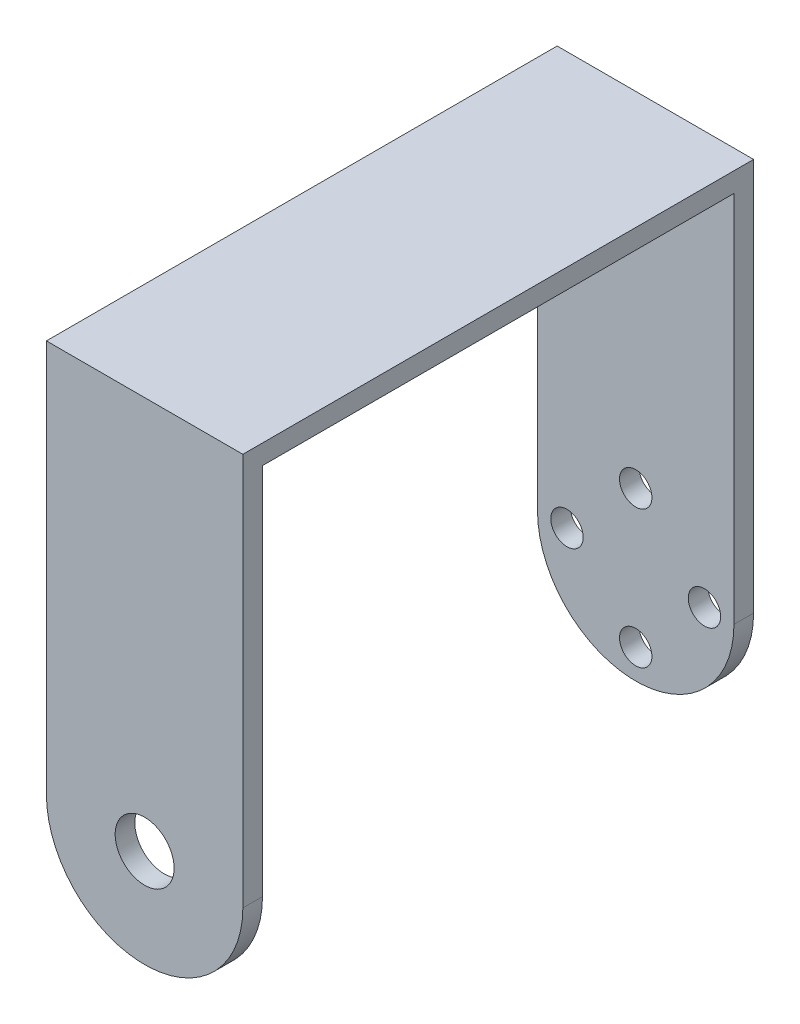
ISO-10303-21;
HEADER;
FILE_DESCRIPTION(('STEP AP214'),'2;1');
FILE_NAME('part.step','',(''),(''),'','','');
FILE_SCHEMA(('AUTOMOTIVE_DESIGN { 1 0 10303 214 1 1 1 1 }'));
ENDSEC;
DATA;
#1=APPLICATION_CONTEXT('core data for automotive mechanical design processes');
#2=APPLICATION_PROTOCOL_DEFINITION('international standard','automotive_design',2000,#1);
#3=PRODUCT_CONTEXT('',#1,'mechanical');
#4=PRODUCT('Part','Part','',(#3));
#5=PRODUCT_RELATED_PRODUCT_CATEGORY('part','',(#4));
#6=PRODUCT_DEFINITION_FORMATION('','',#4);
#7=PRODUCT_DEFINITION_CONTEXT('part definition',#1,'design');
#8=PRODUCT_DEFINITION('design','',#6,#7);
#9=PRODUCT_DEFINITION_SHAPE('','',#8);
#10=(LENGTH_UNIT() NAMED_UNIT(*) SI_UNIT(.MILLI.,.METRE.));
#11=(NAMED_UNIT(*) PLANE_ANGLE_UNIT() SI_UNIT($,.RADIAN.));
#12=(NAMED_UNIT(*) SI_UNIT($,.STERADIAN.) SOLID_ANGLE_UNIT());
#13=UNCERTAINTY_MEASURE_WITH_UNIT(LENGTH_MEASURE(1.E-05),#10,'distance_accuracy_value','');
#14=(GEOMETRIC_REPRESENTATION_CONTEXT(3) GLOBAL_UNCERTAINTY_ASSIGNED_CONTEXT((#13)) GLOBAL_UNIT_ASSIGNED_CONTEXT((#10,
#11,#12)) REPRESENTATION_CONTEXT('',''));
#15=CARTESIAN_POINT('',(0.,0.,0.));
#16=DIRECTION('',(0.,0.,1.));
#17=DIRECTION('',(1.,0.,0.));
#18=AXIS2_PLACEMENT_3D('',#15,#16,#17);
#19=CARTESIAN_POINT('',(0.,38.,52.));
#20=DIRECTION('',(0.,1.,0.));
#21=DIRECTION('',(0.,0.,1.));
#22=AXIS2_PLACEMENT_3D('',#19,#20,#21);
#23=PLANE('',#22);
#24=DIRECTION('',(1.,0.,0.));
#25=VECTOR('',#24,1.);
#26=CARTESIAN_POINT('',(0.,38.,50.));
#27=LINE('',#26,#25);
#28=CARTESIAN_POINT('',(0.,38.,50.));
#29=VERTEX_POINT('',#28);
#30=CARTESIAN_POINT('',(20.,38.,50.));
#31=VERTEX_POINT('',#30);
#32=EDGE_CURVE('E11',#29,#31,#27,.T.);
#33=ORIENTED_EDGE('',*,*,#32,.F.);
#34=DIRECTION('',(0.,0.,-1.));
#35=VECTOR('',#34,1.);
#36=CARTESIAN_POINT('',(0.,38.,52.));
#37=LINE('',#36,#35);
#38=CARTESIAN_POINT('',(0.,38.,2.));
#39=VERTEX_POINT('',#38);
#40=EDGE_CURVE('E55',#29,#39,#37,.T.);
#41=ORIENTED_EDGE('',*,*,#40,.T.);
#42=DIRECTION('',(1.,0.,0.));
#43=VECTOR('',#42,1.);
#44=CARTESIAN_POINT('',(0.,38.,2.));
#45=LINE('',#44,#43);
#46=CARTESIAN_POINT('',(20.,38.,2.));
#47=VERTEX_POINT('',#46);
#48=EDGE_CURVE('E143',#39,#47,#45,.T.);
#49=ORIENTED_EDGE('',*,*,#48,.T.);
#50=DIRECTION('',(0.,0.,-1.));
#51=VECTOR('',#50,1.);
#52=CARTESIAN_POINT('',(20.,38.,52.));
#53=LINE('',#52,#51);
#54=EDGE_CURVE('E113',#31,#47,#53,.T.);
#55=ORIENTED_EDGE('',*,*,#54,.F.);
#56=EDGE_LOOP('',(#33,#41,#49,#55));
#57=FACE_BOUND('',#56,.T.);
#58=ADVANCED_FACE('F39',(#57),#23,.F.);
#59=CARTESIAN_POINT('',(10.,0.,2.));
#60=DIRECTION('',(0.,0.,-1.));
#61=DIRECTION('',(-1.,0.,0.));
#62=AXIS2_PLACEMENT_3D('',#59,#60,#61);
#63=PLANE('',#62);
#64=CARTESIAN_POINT('',(10.,-7.,2.));
#65=DIRECTION('',(0.,0.,-1.));
#66=DIRECTION('',(-1.,0.,0.));
#67=AXIS2_PLACEMENT_3D('',#64,#65,#66);
#68=CIRCLE('',#67,1.65);
#69=CARTESIAN_POINT('',(8.35,-7.,2.));
#70=VERTEX_POINT('',#69);
#71=EDGE_CURVE('E188',#70,#70,#68,.F.);
#72=ORIENTED_EDGE('',*,*,#71,.F.);
#73=EDGE_LOOP('',(#72));
#74=FACE_BOUND('',#73,.T.);
#75=CARTESIAN_POINT('',(17.,0.,2.));
#76=DIRECTION('',(0.,0.,-1.));
#77=DIRECTION('',(-1.,0.,0.));
#78=AXIS2_PLACEMENT_3D('',#75,#76,#77);
#79=CIRCLE('',#78,1.65);
#80=CARTESIAN_POINT('',(15.35,0.,2.));
#81=VERTEX_POINT('',#80);
#82=EDGE_CURVE('E209',#81,#81,#79,.F.);
#83=ORIENTED_EDGE('',*,*,#82,.F.);
#84=EDGE_LOOP('',(#83));
#85=FACE_BOUND('',#84,.T.);
#86=CARTESIAN_POINT('',(9.99999999999995,6.99999999999993,2.));
#87=DIRECTION('',(0.,0.,-1.));
#88=DIRECTION('',(-1.,0.,0.));
#89=AXIS2_PLACEMENT_3D('',#86,#87,#88);
#90=CIRCLE('',#89,1.65);
#91=CARTESIAN_POINT('',(8.34999999999995,6.99999999999993,2.));
#92=VERTEX_POINT('',#91);
#93=EDGE_CURVE('E201',#92,#92,#90,.F.);
#94=ORIENTED_EDGE('',*,*,#93,.F.);
#95=EDGE_LOOP('',(#94));
#96=FACE_BOUND('',#95,.T.);
#97=CARTESIAN_POINT('',(3.00000000000004,-1.05818132034585E-13,2.));
#98=DIRECTION('',(0.,0.,-1.));
#99=DIRECTION('',(-1.,0.,0.));
#100=AXIS2_PLACEMENT_3D('',#97,#98,#99);
#101=CIRCLE('',#100,1.65);
#102=CARTESIAN_POINT('',(1.35000000000004,-1.05818132034585E-13,2.));
#103=VERTEX_POINT('',#102);
#104=EDGE_CURVE('E193',#103,#103,#101,.F.);
#105=ORIENTED_EDGE('',*,*,#104,.F.);
#106=EDGE_LOOP('',(#105));
#107=FACE_BOUND('',#106,.T.);
#108=ORIENTED_EDGE('',*,*,#48,.F.);
#109=DIRECTION('',(0.,-1.,0.));
#110=VECTOR('',#109,1.);
#111=CARTESIAN_POINT('',(0.,0.,2.));
#112=LINE('',#111,#110);
#113=CARTESIAN_POINT('',(0.,0.,2.));
#114=VERTEX_POINT('',#113);
#115=EDGE_CURVE('E63',#39,#114,#112,.T.);
#116=ORIENTED_EDGE('',*,*,#115,.T.);
#117=CARTESIAN_POINT('',(10.,0.,2.));
#118=DIRECTION('',(0.,0.,1.));
#119=DIRECTION('',(-1.,0.,0.));
#120=AXIS2_PLACEMENT_3D('',#117,#118,#119);
#121=CIRCLE('',#120,10.);
#122=CARTESIAN_POINT('',(20.,0.,2.));
#123=VERTEX_POINT('',#122);
#124=EDGE_CURVE('E95',#114,#123,#121,.T.);
#125=ORIENTED_EDGE('',*,*,#124,.T.);
#126=DIRECTION('',(0.,1.,0.));
#127=VECTOR('',#126,1.);
#128=CARTESIAN_POINT('',(20.,0.,2.));
#129=LINE('',#128,#127);
#130=EDGE_CURVE('E131',#123,#47,#129,.T.);
#131=ORIENTED_EDGE('',*,*,#130,.T.);
#132=EDGE_LOOP('',(#108,#116,#125,#131));
#133=FACE_BOUND('',#132,.T.);
#134=ADVANCED_FACE('F136',(#74,#85,#96,#107,#133),#63,.F.);
#135=CARTESIAN_POINT('',(10.,0.,2.));
#136=DIRECTION('',(0.,0.,-1.));
#137=DIRECTION('',(-1.,0.,0.));
#138=AXIS2_PLACEMENT_3D('',#135,#136,#137);
#139=CYLINDRICAL_SURFACE('',#138,10.);
#140=CARTESIAN_POINT('',(10.,0.,0.));
#141=DIRECTION('',(0.,0.,1.));
#142=DIRECTION('',(-1.,0.,0.));
#143=AXIS2_PLACEMENT_3D('',#140,#141,#142);
#144=CIRCLE('',#143,10.);
#145=CARTESIAN_POINT('',(0.,0.,0.));
#146=VERTEX_POINT('',#145);
#147=CARTESIAN_POINT('',(20.,0.,0.));
#148=VERTEX_POINT('',#147);
#149=EDGE_CURVE('E101',#146,#148,#144,.T.);
#150=ORIENTED_EDGE('',*,*,#149,.T.);
#151=DIRECTION('',(0.,0.,-1.));
#152=VECTOR('',#151,1.);
#153=CARTESIAN_POINT('',(20.,0.,2.));
#154=LINE('',#153,#152);
#155=EDGE_CURVE('E48',#123,#148,#154,.T.);
#156=ORIENTED_EDGE('',*,*,#155,.F.);
#157=ORIENTED_EDGE('',*,*,#124,.F.);
#158=DIRECTION('',(0.,0.,-1.));
#159=VECTOR('',#158,1.);
#160=CARTESIAN_POINT('',(0.,0.,2.));
#161=LINE('',#160,#159);
#162=EDGE_CURVE('E85',#114,#146,#161,.T.);
#163=ORIENTED_EDGE('',*,*,#162,.T.);
#164=EDGE_LOOP('',(#150,#156,#157,#163));
#165=FACE_BOUND('',#164,.T.);
#166=ADVANCED_FACE('F41',(#165),#139,.T.);
#167=CARTESIAN_POINT('',(20.,0.,2.));
#168=DIRECTION('',(-1.,0.,0.));
#169=DIRECTION('',(0.,0.,1.));
#170=AXIS2_PLACEMENT_3D('',#167,#168,#169);
#171=PLANE('',#170);
#172=DIRECTION('',(0.,1.,0.));
#173=VECTOR('',#172,1.);
#174=CARTESIAN_POINT('',(20.,40.,52.));
#175=LINE('',#174,#173);
#176=CARTESIAN_POINT('',(20.,0.,52.));
#177=VERTEX_POINT('',#176);
#178=CARTESIAN_POINT('',(20.,40.,52.));
#179=VERTEX_POINT('',#178);
#180=EDGE_CURVE('E151',#177,#179,#175,.T.);
#181=ORIENTED_EDGE('',*,*,#180,.F.);
#182=DIRECTION('',(0.,0.,1.));
#183=VECTOR('',#182,1.);
#184=CARTESIAN_POINT('',(20.,0.,50.));
#185=LINE('',#184,#183);
#186=CARTESIAN_POINT('',(20.,0.,50.));
#187=VERTEX_POINT('',#186);
#188=EDGE_CURVE('E161',#187,#177,#185,.T.);
#189=ORIENTED_EDGE('',*,*,#188,.F.);
#190=DIRECTION('',(0.,1.,0.));
#191=VECTOR('',#190,1.);
#192=CARTESIAN_POINT('',(20.,0.,50.));
#193=LINE('',#192,#191);
#194=EDGE_CURVE('E165',#187,#31,#193,.T.);
#195=ORIENTED_EDGE('',*,*,#194,.T.);
#196=ORIENTED_EDGE('',*,*,#54,.T.);
#197=ORIENTED_EDGE('',*,*,#130,.F.);
#198=ORIENTED_EDGE('',*,*,#155,.T.);
#199=DIRECTION('',(0.,1.,0.));
#200=VECTOR('',#199,1.);
#201=CARTESIAN_POINT('',(20.,0.,0.));
#202=LINE('',#201,#200);
#203=CARTESIAN_POINT('',(20.,40.,0.));
#204=VERTEX_POINT('',#203);
#205=EDGE_CURVE('E106',#148,#204,#202,.T.);
#206=ORIENTED_EDGE('',*,*,#205,.T.);
#207=DIRECTION('',(0.,0.,-1.));
#208=VECTOR('',#207,1.);
#209=CARTESIAN_POINT('',(20.,40.,2.));
#210=LINE('',#209,#208);
#211=EDGE_CURVE('E122',#179,#204,#210,.T.);
#212=ORIENTED_EDGE('',*,*,#211,.F.);
#213=EDGE_LOOP('',(#181,#189,#195,#196,#197,#198,#206,#212));
#214=FACE_BOUND('',#213,.T.);
#215=ADVANCED_FACE('F127',(#214),#171,.F.);
#216=CARTESIAN_POINT('',(0.,40.,2.));
#217=DIRECTION('',(0.,-1.,0.));
#218=DIRECTION('',(0.,0.,-1.));
#219=AXIS2_PLACEMENT_3D('',#216,#217,#218);
#220=PLANE('',#219);
#221=ORIENTED_EDGE('',*,*,#211,.T.);
#222=DIRECTION('',(-1.,0.,0.));
#223=VECTOR('',#222,1.);
#224=CARTESIAN_POINT('',(0.,40.,0.));
#225=LINE('',#224,#223);
#226=CARTESIAN_POINT('',(0.,40.,0.));
#227=VERTEX_POINT('',#226);
#228=EDGE_CURVE('E96',#204,#227,#225,.T.);
#229=ORIENTED_EDGE('',*,*,#228,.T.);
#230=DIRECTION('',(0.,0.,-1.));
#231=VECTOR('',#230,1.);
#232=CARTESIAN_POINT('',(0.,40.,2.));
#233=LINE('',#232,#231);
#234=CARTESIAN_POINT('',(0.,40.,52.));
#235=VERTEX_POINT('',#234);
#236=EDGE_CURVE('E89',#235,#227,#233,.T.);
#237=ORIENTED_EDGE('',*,*,#236,.F.);
#238=DIRECTION('',(-1.,0.,0.));
#239=VECTOR('',#238,1.);
#240=CARTESIAN_POINT('',(0.,40.,52.));
#241=LINE('',#240,#239);
#242=EDGE_CURVE('E142',#179,#235,#241,.T.);
#243=ORIENTED_EDGE('',*,*,#242,.F.);
#244=EDGE_LOOP('',(#221,#229,#237,#243));
#245=FACE_BOUND('',#244,.T.);
#246=ADVANCED_FACE('F261',(#245),#220,.F.);
#247=CARTESIAN_POINT('',(0.,0.,2.));
#248=DIRECTION('',(1.,0.,0.));
#249=DIRECTION('',(0.,0.,-1.));
#250=AXIS2_PLACEMENT_3D('',#247,#248,#249);
#251=PLANE('',#250);
#252=ORIENTED_EDGE('',*,*,#236,.T.);
#253=DIRECTION('',(0.,-1.,0.));
#254=VECTOR('',#253,1.);
#255=CARTESIAN_POINT('',(0.,0.,0.));
#256=LINE('',#255,#254);
#257=EDGE_CURVE('E82',#227,#146,#256,.T.);
#258=ORIENTED_EDGE('',*,*,#257,.T.);
#259=ORIENTED_EDGE('',*,*,#162,.F.);
#260=ORIENTED_EDGE('',*,*,#115,.F.);
#261=ORIENTED_EDGE('',*,*,#40,.F.);
#262=DIRECTION('',(0.,-1.,0.));
#263=VECTOR('',#262,1.);
#264=CARTESIAN_POINT('',(0.,0.,50.));
#265=LINE('',#264,#263);
#266=CARTESIAN_POINT('',(0.,0.,50.));
#267=VERTEX_POINT('',#266);
#268=EDGE_CURVE('E174',#29,#267,#265,.T.);
#269=ORIENTED_EDGE('',*,*,#268,.T.);
#270=DIRECTION('',(0.,0.,1.));
#271=VECTOR('',#270,1.);
#272=CARTESIAN_POINT('',(0.,0.,50.));
#273=LINE('',#272,#271);
#274=CARTESIAN_POINT('',(0.,0.,52.));
#275=VERTEX_POINT('',#274);
#276=EDGE_CURVE('E147',#267,#275,#273,.T.);
#277=ORIENTED_EDGE('',*,*,#276,.T.);
#278=DIRECTION('',(0.,-1.,0.));
#279=VECTOR('',#278,1.);
#280=CARTESIAN_POINT('',(0.,40.,52.));
#281=LINE('',#280,#279);
#282=EDGE_CURVE('E146',#235,#275,#281,.T.);
#283=ORIENTED_EDGE('',*,*,#282,.F.);
#284=EDGE_LOOP('',(#252,#258,#259,#260,#261,#269,#277,#283));
#285=FACE_BOUND('',#284,.T.);
#286=ADVANCED_FACE('F84',(#285),#251,.F.);
#287=CARTESIAN_POINT('',(10.,0.,0.));
#288=DIRECTION('',(0.,0.,-1.));
#289=DIRECTION('',(-1.,0.,0.));
#290=AXIS2_PLACEMENT_3D('',#287,#288,#289);
#291=PLANE('',#290);
#292=CARTESIAN_POINT('',(10.,-7.,0.));
#293=DIRECTION('',(0.,0.,-1.));
#294=DIRECTION('',(-1.,0.,0.));
#295=AXIS2_PLACEMENT_3D('',#292,#293,#294);
#296=CIRCLE('',#295,1.65);
#297=CARTESIAN_POINT('',(8.35,-7.,0.));
#298=VERTEX_POINT('',#297);
#299=EDGE_CURVE('E213',#298,#298,#296,.T.);
#300=ORIENTED_EDGE('',*,*,#299,.F.);
#301=EDGE_LOOP('',(#300));
#302=FACE_BOUND('',#301,.T.);
#303=CARTESIAN_POINT('',(17.,0.,0.));
#304=DIRECTION('',(0.,0.,-1.));
#305=DIRECTION('',(-1.,0.,0.));
#306=AXIS2_PLACEMENT_3D('',#303,#304,#305);
#307=CIRCLE('',#306,1.65);
#308=CARTESIAN_POINT('',(15.35,0.,0.));
#309=VERTEX_POINT('',#308);
#310=EDGE_CURVE('E205',#309,#309,#307,.T.);
#311=ORIENTED_EDGE('',*,*,#310,.F.);
#312=EDGE_LOOP('',(#311));
#313=FACE_BOUND('',#312,.T.);
#314=CARTESIAN_POINT('',(9.99999999999995,6.99999999999993,0.));
#315=DIRECTION('',(0.,0.,-1.));
#316=DIRECTION('',(-1.,0.,0.));
#317=AXIS2_PLACEMENT_3D('',#314,#315,#316);
#318=CIRCLE('',#317,1.65);
#319=CARTESIAN_POINT('',(8.34999999999995,6.99999999999993,0.));
#320=VERTEX_POINT('',#319);
#321=EDGE_CURVE('E197',#320,#320,#318,.T.);
#322=ORIENTED_EDGE('',*,*,#321,.F.);
#323=EDGE_LOOP('',(#322));
#324=FACE_BOUND('',#323,.T.);
#325=CARTESIAN_POINT('',(3.00000000000004,-1.05818132034585E-13,0.));
#326=DIRECTION('',(0.,0.,-1.));
#327=DIRECTION('',(-1.,0.,0.));
#328=AXIS2_PLACEMENT_3D('',#325,#326,#327);
#329=CIRCLE('',#328,1.65);
#330=CARTESIAN_POINT('',(1.35000000000004,-1.05818132034585E-13,0.));
#331=VERTEX_POINT('',#330);
#332=EDGE_CURVE('E189',#331,#331,#329,.T.);
#333=ORIENTED_EDGE('',*,*,#332,.F.);
#334=EDGE_LOOP('',(#333));
#335=FACE_BOUND('',#334,.T.);
#336=ORIENTED_EDGE('',*,*,#149,.F.);
#337=ORIENTED_EDGE('',*,*,#257,.F.);
#338=ORIENTED_EDGE('',*,*,#228,.F.);
#339=ORIENTED_EDGE('',*,*,#205,.F.);
#340=EDGE_LOOP('',(#336,#337,#338,#339));
#341=FACE_BOUND('',#340,.T.);
#342=ADVANCED_FACE('F104',(#302,#313,#324,#335,#341),#291,.T.);
#343=CARTESIAN_POINT('',(0.,0.,52.));
#344=DIRECTION('',(0.,0.,1.));
#345=DIRECTION('',(1.,0.,0.));
#346=AXIS2_PLACEMENT_3D('',#343,#344,#345);
#347=PLANE('',#346);
#348=CARTESIAN_POINT('',(10.,0.,52.));
#349=DIRECTION('',(0.,0.,1.));
#350=DIRECTION('',(1.,0.,0.));
#351=AXIS2_PLACEMENT_3D('',#348,#349,#350);
#352=CIRCLE('',#351,3.);
#353=CARTESIAN_POINT('',(13.,0.,52.));
#354=VERTEX_POINT('',#353);
#355=EDGE_CURVE('E184',#354,#354,#352,.T.);
#356=ORIENTED_EDGE('',*,*,#355,.F.);
#357=EDGE_LOOP('',(#356));
#358=FACE_BOUND('',#357,.T.);
#359=ORIENTED_EDGE('',*,*,#282,.T.);
#360=CARTESIAN_POINT('',(10.,0.,52.));
#361=DIRECTION('',(0.,0.,1.));
#362=DIRECTION('',(-1.,0.,0.));
#363=AXIS2_PLACEMENT_3D('',#360,#361,#362);
#364=CIRCLE('',#363,10.);
#365=EDGE_CURVE('E166',#275,#177,#364,.T.);
#366=ORIENTED_EDGE('',*,*,#365,.T.);
#367=ORIENTED_EDGE('',*,*,#180,.T.);
#368=ORIENTED_EDGE('',*,*,#242,.T.);
#369=EDGE_LOOP('',(#359,#366,#367,#368));
#370=FACE_BOUND('',#369,.T.);
#371=ADVANCED_FACE('F253',(#358,#370),#347,.T.);
#372=CARTESIAN_POINT('',(10.,0.,50.));
#373=DIRECTION('',(0.,0.,1.));
#374=DIRECTION('',(-1.,0.,0.));
#375=AXIS2_PLACEMENT_3D('',#372,#373,#374);
#376=PLANE('',#375);
#377=CARTESIAN_POINT('',(10.,0.,50.));
#378=DIRECTION('',(0.,0.,1.));
#379=DIRECTION('',(1.,0.,0.));
#380=AXIS2_PLACEMENT_3D('',#377,#378,#379);
#381=CIRCLE('',#380,3.);
#382=CARTESIAN_POINT('',(13.,0.,50.));
#383=VERTEX_POINT('',#382);
#384=EDGE_CURVE('E171',#383,#383,#381,.F.);
#385=ORIENTED_EDGE('',*,*,#384,.F.);
#386=EDGE_LOOP('',(#385));
#387=FACE_BOUND('',#386,.T.);
#388=ORIENTED_EDGE('',*,*,#268,.F.);
#389=ORIENTED_EDGE('',*,*,#32,.T.);
#390=ORIENTED_EDGE('',*,*,#194,.F.);
#391=CARTESIAN_POINT('',(10.,0.,50.));
#392=DIRECTION('',(0.,0.,1.));
#393=DIRECTION('',(-1.,0.,0.));
#394=AXIS2_PLACEMENT_3D('',#391,#392,#393);
#395=CIRCLE('',#394,10.);
#396=EDGE_CURVE('E170',#267,#187,#395,.T.);
#397=ORIENTED_EDGE('',*,*,#396,.F.);
#398=EDGE_LOOP('',(#388,#389,#390,#397));
#399=FACE_BOUND('',#398,.T.);
#400=ADVANCED_FACE('F336',(#387,#399),#376,.F.);
#401=CARTESIAN_POINT('',(10.,0.,50.));
#402=DIRECTION('',(0.,0.,1.));
#403=DIRECTION('',(1.,0.,0.));
#404=AXIS2_PLACEMENT_3D('',#401,#402,#403);
#405=CYLINDRICAL_SURFACE('',#404,10.);
#406=ORIENTED_EDGE('',*,*,#365,.F.);
#407=ORIENTED_EDGE('',*,*,#276,.F.);
#408=ORIENTED_EDGE('',*,*,#396,.T.);
#409=ORIENTED_EDGE('',*,*,#188,.T.);
#410=EDGE_LOOP('',(#406,#407,#408,#409));
#411=FACE_BOUND('',#410,.T.);
#412=ADVANCED_FACE('F245',(#411),#405,.T.);
#413=CARTESIAN_POINT('',(10.,0.,-0.001000000000001));
#414=DIRECTION('',(0.,0.,1.));
#415=DIRECTION('',(1.,0.,0.));
#416=AXIS2_PLACEMENT_3D('',#413,#414,#415);
#417=CYLINDRICAL_SURFACE('',#416,3.);
#418=ORIENTED_EDGE('',*,*,#355,.T.);
#419=EDGE_LOOP('',(#418));
#420=FACE_BOUND('',#419,.T.);
#421=ORIENTED_EDGE('',*,*,#384,.T.);
#422=EDGE_LOOP('',(#421));
#423=FACE_BOUND('',#422,.T.);
#424=ADVANCED_FACE('F235',(#420,#423),#417,.F.);
#425=CARTESIAN_POINT('',(3.00000000000004,-1.05818132034585E-13,52.001));
#426=DIRECTION('',(0.,0.,-1.));
#427=DIRECTION('',(-1.,0.,0.));
#428=AXIS2_PLACEMENT_3D('',#425,#426,#427);
#429=CYLINDRICAL_SURFACE('',#428,1.65);
#430=ORIENTED_EDGE('',*,*,#332,.T.);
#431=EDGE_LOOP('',(#430));
#432=FACE_BOUND('',#431,.T.);
#433=ORIENTED_EDGE('',*,*,#104,.T.);
#434=EDGE_LOOP('',(#433));
#435=FACE_BOUND('',#434,.T.);
#436=ADVANCED_FACE('F232',(#432,#435),#429,.F.);
#437=CARTESIAN_POINT('',(9.99999999999995,6.99999999999993,52.001));
#438=DIRECTION('',(0.,0.,-1.));
#439=DIRECTION('',(-1.,0.,0.));
#440=AXIS2_PLACEMENT_3D('',#437,#438,#439);
#441=CYLINDRICAL_SURFACE('',#440,1.65);
#442=ORIENTED_EDGE('',*,*,#321,.T.);
#443=EDGE_LOOP('',(#442));
#444=FACE_BOUND('',#443,.T.);
#445=ORIENTED_EDGE('',*,*,#93,.T.);
#446=EDGE_LOOP('',(#445));
#447=FACE_BOUND('',#446,.T.);
#448=ADVANCED_FACE('F234',(#444,#447),#441,.F.);
#449=CARTESIAN_POINT('',(17.,0.,52.001));
#450=DIRECTION('',(0.,0.,-1.));
#451=DIRECTION('',(-1.,0.,0.));
#452=AXIS2_PLACEMENT_3D('',#449,#450,#451);
#453=CYLINDRICAL_SURFACE('',#452,1.65);
#454=ORIENTED_EDGE('',*,*,#310,.T.);
#455=EDGE_LOOP('',(#454));
#456=FACE_BOUND('',#455,.T.);
#457=ORIENTED_EDGE('',*,*,#82,.T.);
#458=EDGE_LOOP('',(#457));
#459=FACE_BOUND('',#458,.T.);
#460=ADVANCED_FACE('F242',(#456,#459),#453,.F.);
#461=CARTESIAN_POINT('',(10.,-7.,52.001));
#462=DIRECTION('',(0.,0.,-1.));
#463=DIRECTION('',(-1.,0.,0.));
#464=AXIS2_PLACEMENT_3D('',#461,#462,#463);
#465=CYLINDRICAL_SURFACE('',#464,1.65);
#466=ORIENTED_EDGE('',*,*,#299,.T.);
#467=EDGE_LOOP('',(#466));
#468=FACE_BOUND('',#467,.T.);
#469=ORIENTED_EDGE('',*,*,#71,.T.);
#470=EDGE_LOOP('',(#469));
#471=FACE_BOUND('',#470,.T.);
#472=ADVANCED_FACE('F221',(#468,#471),#465,.F.);
#473=CLOSED_SHELL('',(#58,#134,#166,#215,#246,#286,#342,#371,#400,#412,#424,#436,#448,#460,#472));
#474=MANIFOLD_SOLID_BREP('B2',#473);
#475=ADVANCED_BREP_SHAPE_REPRESENTATION('',(#18,#474),#14);
#476=SHAPE_DEFINITION_REPRESENTATION(#9,#475);
ENDSEC;
END-ISO-10303-21;
